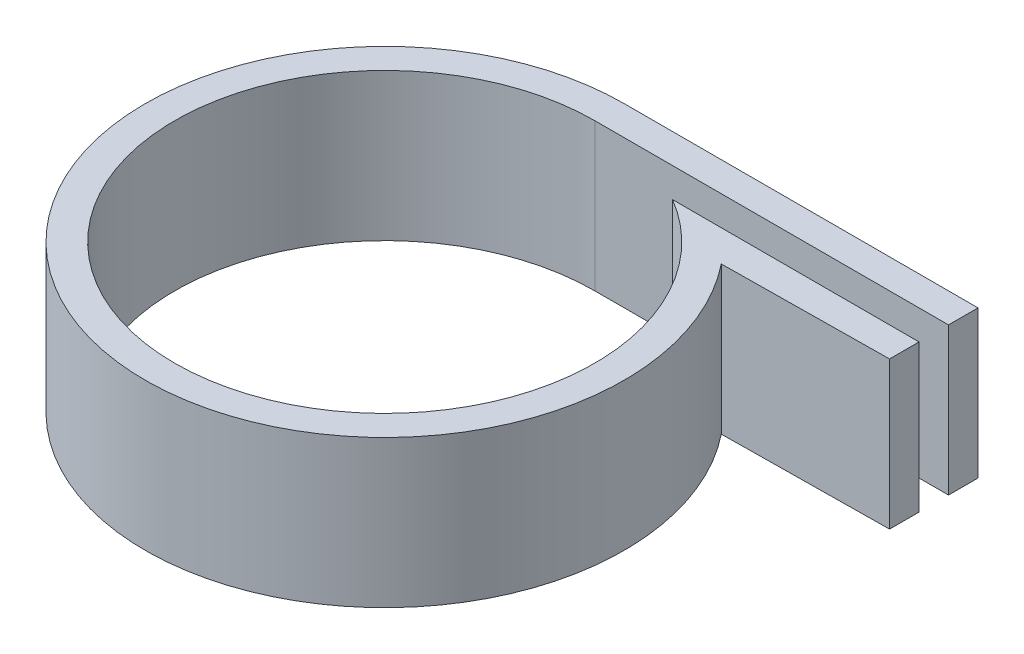
ISO-10303-21;
HEADER;
FILE_DESCRIPTION(('STEP AP214'),'2;1');
FILE_NAME('part.step','',(''),(''),'','','');
FILE_SCHEMA(('AUTOMOTIVE_DESIGN { 1 0 10303 214 1 1 1 1 }'));
ENDSEC;
DATA;
#1=APPLICATION_CONTEXT('core data for automotive mechanical design processes');
#2=APPLICATION_PROTOCOL_DEFINITION('international standard','automotive_design',2000,#1);
#3=PRODUCT_CONTEXT('',#1,'mechanical');
#4=PRODUCT('Part','Part','',(#3));
#5=PRODUCT_RELATED_PRODUCT_CATEGORY('part','',(#4));
#6=PRODUCT_DEFINITION_FORMATION('','',#4);
#7=PRODUCT_DEFINITION_CONTEXT('part definition',#1,'design');
#8=PRODUCT_DEFINITION('design','',#6,#7);
#9=PRODUCT_DEFINITION_SHAPE('','',#8);
#10=(LENGTH_UNIT() NAMED_UNIT(*) SI_UNIT(.MILLI.,.METRE.));
#11=(NAMED_UNIT(*) PLANE_ANGLE_UNIT() SI_UNIT($,.RADIAN.));
#12=(NAMED_UNIT(*) SI_UNIT($,.STERADIAN.) SOLID_ANGLE_UNIT());
#13=UNCERTAINTY_MEASURE_WITH_UNIT(LENGTH_MEASURE(1.E-05),#10,'distance_accuracy_value','');
#14=(GEOMETRIC_REPRESENTATION_CONTEXT(3) GLOBAL_UNCERTAINTY_ASSIGNED_CONTEXT((#13)) GLOBAL_UNIT_ASSIGNED_CONTEXT((#10,
#11,#12)) REPRESENTATION_CONTEXT('',''));
#15=CARTESIAN_POINT('',(0.,0.,0.));
#16=DIRECTION('',(0.,0.,1.));
#17=DIRECTION('',(1.,0.,0.));
#18=AXIS2_PLACEMENT_3D('',#15,#16,#17);
#19=CARTESIAN_POINT('',(0.,10.,0.));
#20=DIRECTION('',(0.,-1.,0.));
#21=DIRECTION('',(0.,0.,-1.));
#22=AXIS2_PLACEMENT_3D('',#19,#20,#21);
#23=CYLINDRICAL_SURFACE('',#22,16.25);
#24=CARTESIAN_POINT('',(0.,0.,0.));
#25=DIRECTION('',(0.,1.,0.));
#26=DIRECTION('',(0.,0.,1.));
#27=AXIS2_PLACEMENT_3D('',#24,#25,#26);
#28=CIRCLE('',#27,16.25);
#29=CARTESIAN_POINT('',(0.,0.,-16.25));
#30=VERTEX_POINT('',#29);
#31=CARTESIAN_POINT('',(12.7120506340973,0.,-10.1225623572367));
#32=VERTEX_POINT('',#31);
#33=EDGE_CURVE('E129',#30,#32,#28,.T.);
#34=ORIENTED_EDGE('',*,*,#33,.T.);
#35=DIRECTION('',(0.,-1.,0.));
#36=VECTOR('',#35,1.);
#37=CARTESIAN_POINT('',(12.7120506340973,10.,-10.1225623572367));
#38=LINE('',#37,#36);
#39=CARTESIAN_POINT('',(12.7120506340973,10.,-10.1225623572367));
#40=VERTEX_POINT('',#39);
#41=EDGE_CURVE('E11',#40,#32,#38,.T.);
#42=ORIENTED_EDGE('',*,*,#41,.F.);
#43=CARTESIAN_POINT('',(0.,10.,0.));
#44=DIRECTION('',(0.,1.,0.));
#45=DIRECTION('',(0.,0.,1.));
#46=AXIS2_PLACEMENT_3D('',#43,#44,#45);
#47=CIRCLE('',#46,16.25);
#48=CARTESIAN_POINT('',(0.,10.,-16.25));
#49=VERTEX_POINT('',#48);
#50=EDGE_CURVE('E143',#49,#40,#47,.T.);
#51=ORIENTED_EDGE('',*,*,#50,.F.);
#52=DIRECTION('',(0.,-1.,0.));
#53=VECTOR('',#52,1.);
#54=CARTESIAN_POINT('',(0.,10.,-16.25));
#55=LINE('',#54,#53);
#56=EDGE_CURVE('E125',#49,#30,#55,.T.);
#57=ORIENTED_EDGE('',*,*,#56,.T.);
#58=EDGE_LOOP('',(#34,#42,#51,#57));
#59=FACE_BOUND('',#58,.T.);
#60=ADVANCED_FACE('F33',(#59),#23,.T.);
#61=CARTESIAN_POINT('',(24.,10.,-10.25));
#62=DIRECTION('',(-0.0112889877486131,0.,-0.999936277347518));
#63=DIRECTION('',(-0.999936277347518,0.,0.0112889877486131));
#64=AXIS2_PLACEMENT_3D('',#61,#62,#63);
#65=PLANE('',#64);
#66=DIRECTION('',(0.999936277347518,0.,-0.0112889877486131));
#67=VECTOR('',#66,1.);
#68=CARTESIAN_POINT('',(24.,0.,-10.25));
#69=LINE('',#68,#67);
#70=CARTESIAN_POINT('',(24.,0.,-10.25));
#71=VERTEX_POINT('',#70);
#72=EDGE_CURVE('E132',#32,#71,#69,.T.);
#73=ORIENTED_EDGE('',*,*,#72,.T.);
#74=DIRECTION('',(0.,-1.,0.));
#75=VECTOR('',#74,1.);
#76=CARTESIAN_POINT('',(24.,10.,-10.25));
#77=LINE('',#76,#75);
#78=CARTESIAN_POINT('',(24.,10.,-10.25));
#79=VERTEX_POINT('',#78);
#80=EDGE_CURVE('E41',#79,#71,#77,.T.);
#81=ORIENTED_EDGE('',*,*,#80,.F.);
#82=DIRECTION('',(0.999936277347518,0.,-0.0112889877486131));
#83=VECTOR('',#82,1.);
#84=CARTESIAN_POINT('',(24.,10.,-10.25));
#85=LINE('',#84,#83);
#86=EDGE_CURVE('E92',#40,#79,#85,.T.);
#87=ORIENTED_EDGE('',*,*,#86,.F.);
#88=ORIENTED_EDGE('',*,*,#41,.T.);
#89=EDGE_LOOP('',(#73,#81,#87,#88));
#90=FACE_BOUND('',#89,.T.);
#91=ADVANCED_FACE('F178',(#90),#65,.F.);
#92=CARTESIAN_POINT('',(24.,10.,-12.25));
#93=DIRECTION('',(-1.,0.,0.));
#94=DIRECTION('',(0.,0.,1.));
#95=AXIS2_PLACEMENT_3D('',#92,#93,#94);
#96=PLANE('',#95);
#97=DIRECTION('',(0.,0.,-1.));
#98=VECTOR('',#97,1.);
#99=CARTESIAN_POINT('',(24.,0.,-12.25));
#100=LINE('',#99,#98);
#101=CARTESIAN_POINT('',(24.,0.,-12.25));
#102=VERTEX_POINT('',#101);
#103=EDGE_CURVE('E134',#71,#102,#100,.T.);
#104=ORIENTED_EDGE('',*,*,#103,.T.);
#105=DIRECTION('',(0.,-1.,0.));
#106=VECTOR('',#105,1.);
#107=CARTESIAN_POINT('',(24.,10.,-12.25));
#108=LINE('',#107,#106);
#109=CARTESIAN_POINT('',(24.,10.,-12.25));
#110=VERTEX_POINT('',#109);
#111=EDGE_CURVE('E150',#110,#102,#108,.T.);
#112=ORIENTED_EDGE('',*,*,#111,.F.);
#113=DIRECTION('',(0.,0.,-1.));
#114=VECTOR('',#113,1.);
#115=CARTESIAN_POINT('',(24.,10.,-12.25));
#116=LINE('',#115,#114);
#117=EDGE_CURVE('E158',#79,#110,#116,.T.);
#118=ORIENTED_EDGE('',*,*,#117,.F.);
#119=ORIENTED_EDGE('',*,*,#80,.T.);
#120=EDGE_LOOP('',(#104,#112,#118,#119));
#121=FACE_BOUND('',#120,.T.);
#122=ADVANCED_FACE('F156',(#121),#96,.F.);
#123=CARTESIAN_POINT('',(7.28010988928052,10.,-12.25));
#124=DIRECTION('',(0.,0.,1.));
#125=DIRECTION('',(1.,0.,0.));
#126=AXIS2_PLACEMENT_3D('',#123,#124,#125);
#127=PLANE('',#126);
#128=DIRECTION('',(-1.,0.,0.));
#129=VECTOR('',#128,1.);
#130=CARTESIAN_POINT('',(7.28010988928052,0.,-12.25));
#131=LINE('',#130,#129);
#132=CARTESIAN_POINT('',(7.28010988928052,0.,-12.25));
#133=VERTEX_POINT('',#132);
#134=EDGE_CURVE('E136',#102,#133,#131,.T.);
#135=ORIENTED_EDGE('',*,*,#134,.T.);
#136=DIRECTION('',(0.,-1.,0.));
#137=VECTOR('',#136,1.);
#138=CARTESIAN_POINT('',(7.28010988928052,10.,-12.25));
#139=LINE('',#138,#137);
#140=CARTESIAN_POINT('',(7.28010988928052,10.,-12.25));
#141=VERTEX_POINT('',#140);
#142=EDGE_CURVE('E147',#141,#133,#139,.T.);
#143=ORIENTED_EDGE('',*,*,#142,.F.);
#144=DIRECTION('',(-1.,0.,0.));
#145=VECTOR('',#144,1.);
#146=CARTESIAN_POINT('',(7.28010988928052,10.,-12.25));
#147=LINE('',#146,#145);
#148=EDGE_CURVE('E170',#110,#141,#147,.T.);
#149=ORIENTED_EDGE('',*,*,#148,.F.);
#150=ORIENTED_EDGE('',*,*,#111,.T.);
#151=EDGE_LOOP('',(#135,#143,#149,#150));
#152=FACE_BOUND('',#151,.T.);
#153=ADVANCED_FACE('F166',(#152),#127,.F.);
#154=CARTESIAN_POINT('',(0.,10.,0.));
#155=DIRECTION('',(0.,-1.,0.));
#156=DIRECTION('',(0.,0.,-1.));
#157=AXIS2_PLACEMENT_3D('',#154,#155,#156);
#158=CYLINDRICAL_SURFACE('',#157,14.25);
#159=CARTESIAN_POINT('',(0.,0.,0.));
#160=DIRECTION('',(0.,-1.,0.));
#161=DIRECTION('',(0.,0.,1.));
#162=AXIS2_PLACEMENT_3D('',#159,#160,#161);
#163=CIRCLE('',#162,14.25);
#164=CARTESIAN_POINT('',(0.,0.,-14.25));
#165=VERTEX_POINT('',#164);
#166=EDGE_CURVE('E138',#133,#165,#163,.T.);
#167=ORIENTED_EDGE('',*,*,#166,.T.);
#168=DIRECTION('',(0.,-1.,0.));
#169=VECTOR('',#168,1.);
#170=CARTESIAN_POINT('',(0.,10.,-14.25));
#171=LINE('',#170,#169);
#172=CARTESIAN_POINT('',(0.,10.,-14.25));
#173=VERTEX_POINT('',#172);
#174=EDGE_CURVE('E120',#173,#165,#171,.T.);
#175=ORIENTED_EDGE('',*,*,#174,.F.);
#176=CARTESIAN_POINT('',(0.,10.,0.));
#177=DIRECTION('',(0.,-1.,0.));
#178=DIRECTION('',(0.,0.,1.));
#179=AXIS2_PLACEMENT_3D('',#176,#177,#178);
#180=CIRCLE('',#179,14.25);
#181=EDGE_CURVE('E111',#141,#173,#180,.T.);
#182=ORIENTED_EDGE('',*,*,#181,.F.);
#183=ORIENTED_EDGE('',*,*,#142,.T.);
#184=EDGE_LOOP('',(#167,#175,#182,#183));
#185=FACE_BOUND('',#184,.T.);
#186=ADVANCED_FACE('F169',(#185),#158,.F.);
#187=CARTESIAN_POINT('',(0.,10.,-14.25));
#188=DIRECTION('',(0.,0.,-1.));
#189=DIRECTION('',(-1.,0.,0.));
#190=AXIS2_PLACEMENT_3D('',#187,#188,#189);
#191=PLANE('',#190);
#192=DIRECTION('',(1.,0.,0.));
#193=VECTOR('',#192,1.);
#194=CARTESIAN_POINT('',(0.,0.,-14.25));
#195=LINE('',#194,#193);
#196=CARTESIAN_POINT('',(24.,0.,-14.25));
#197=VERTEX_POINT('',#196);
#198=EDGE_CURVE('E119',#165,#197,#195,.T.);
#199=ORIENTED_EDGE('',*,*,#198,.T.);
#200=DIRECTION('',(0.,-1.,0.));
#201=VECTOR('',#200,1.);
#202=CARTESIAN_POINT('',(24.,10.,-14.25));
#203=LINE('',#202,#201);
#204=CARTESIAN_POINT('',(24.,10.,-14.25));
#205=VERTEX_POINT('',#204);
#206=EDGE_CURVE('E116',#205,#197,#203,.T.);
#207=ORIENTED_EDGE('',*,*,#206,.F.);
#208=DIRECTION('',(1.,0.,0.));
#209=VECTOR('',#208,1.);
#210=CARTESIAN_POINT('',(0.,10.,-14.25));
#211=LINE('',#210,#209);
#212=EDGE_CURVE('E105',#173,#205,#211,.T.);
#213=ORIENTED_EDGE('',*,*,#212,.F.);
#214=ORIENTED_EDGE('',*,*,#174,.T.);
#215=EDGE_LOOP('',(#199,#207,#213,#214));
#216=FACE_BOUND('',#215,.T.);
#217=ADVANCED_FACE('F117',(#216),#191,.F.);
#218=CARTESIAN_POINT('',(24.,10.,-16.25));
#219=DIRECTION('',(-1.,0.,0.));
#220=DIRECTION('',(0.,0.,1.));
#221=AXIS2_PLACEMENT_3D('',#218,#219,#220);
#222=PLANE('',#221);
#223=DIRECTION('',(0.,0.,-1.));
#224=VECTOR('',#223,1.);
#225=CARTESIAN_POINT('',(24.,0.,-16.25));
#226=LINE('',#225,#224);
#227=CARTESIAN_POINT('',(24.,0.,-16.25));
#228=VERTEX_POINT('',#227);
#229=EDGE_CURVE('E78',#197,#228,#226,.T.);
#230=ORIENTED_EDGE('',*,*,#229,.T.);
#231=DIRECTION('',(0.,-1.,0.));
#232=VECTOR('',#231,1.);
#233=CARTESIAN_POINT('',(24.,10.,-16.25));
#234=LINE('',#233,#232);
#235=CARTESIAN_POINT('',(24.,10.,-16.25));
#236=VERTEX_POINT('',#235);
#237=EDGE_CURVE('E121',#236,#228,#234,.T.);
#238=ORIENTED_EDGE('',*,*,#237,.F.);
#239=DIRECTION('',(0.,0.,-1.));
#240=VECTOR('',#239,1.);
#241=CARTESIAN_POINT('',(24.,10.,-16.25));
#242=LINE('',#241,#240);
#243=EDGE_CURVE('E109',#205,#236,#242,.T.);
#244=ORIENTED_EDGE('',*,*,#243,.F.);
#245=ORIENTED_EDGE('',*,*,#206,.T.);
#246=EDGE_LOOP('',(#230,#238,#244,#245));
#247=FACE_BOUND('',#246,.T.);
#248=ADVANCED_FACE('F123',(#247),#222,.F.);
#249=CARTESIAN_POINT('',(0.,10.,-16.25));
#250=DIRECTION('',(0.,0.,1.));
#251=DIRECTION('',(1.,0.,0.));
#252=AXIS2_PLACEMENT_3D('',#249,#250,#251);
#253=PLANE('',#252);
#254=DIRECTION('',(-1.,0.,0.));
#255=VECTOR('',#254,1.);
#256=CARTESIAN_POINT('',(0.,0.,-16.25));
#257=LINE('',#256,#255);
#258=EDGE_CURVE('E84',#228,#30,#257,.T.);
#259=ORIENTED_EDGE('',*,*,#258,.T.);
#260=ORIENTED_EDGE('',*,*,#56,.F.);
#261=DIRECTION('',(-1.,0.,0.));
#262=VECTOR('',#261,1.);
#263=CARTESIAN_POINT('',(0.,10.,-16.25));
#264=LINE('',#263,#262);
#265=EDGE_CURVE('E49',#236,#49,#264,.T.);
#266=ORIENTED_EDGE('',*,*,#265,.F.);
#267=ORIENTED_EDGE('',*,*,#237,.T.);
#268=EDGE_LOOP('',(#259,#260,#266,#267));
#269=FACE_BOUND('',#268,.T.);
#270=ADVANCED_FACE('F194',(#269),#253,.F.);
#271=CARTESIAN_POINT('',(0.,10.,0.));
#272=DIRECTION('',(0.,1.,0.));
#273=DIRECTION('',(0.,0.,1.));
#274=AXIS2_PLACEMENT_3D('',#271,#272,#273);
#275=PLANE('',#274);
#276=ORIENTED_EDGE('',*,*,#50,.T.);
#277=ORIENTED_EDGE('',*,*,#86,.T.);
#278=ORIENTED_EDGE('',*,*,#117,.T.);
#279=ORIENTED_EDGE('',*,*,#148,.T.);
#280=ORIENTED_EDGE('',*,*,#181,.T.);
#281=ORIENTED_EDGE('',*,*,#212,.T.);
#282=ORIENTED_EDGE('',*,*,#243,.T.);
#283=ORIENTED_EDGE('',*,*,#265,.T.);
#284=EDGE_LOOP('',(#276,#277,#278,#279,#280,#281,#282,#283));
#285=FACE_BOUND('',#284,.T.);
#286=ADVANCED_FACE('F107',(#285),#275,.T.);
#287=CARTESIAN_POINT('',(0.,0.,0.));
#288=DIRECTION('',(0.,1.,0.));
#289=DIRECTION('',(0.,0.,1.));
#290=AXIS2_PLACEMENT_3D('',#287,#288,#289);
#291=PLANE('',#290);
#292=ORIENTED_EDGE('',*,*,#33,.F.);
#293=ORIENTED_EDGE('',*,*,#258,.F.);
#294=ORIENTED_EDGE('',*,*,#229,.F.);
#295=ORIENTED_EDGE('',*,*,#198,.F.);
#296=ORIENTED_EDGE('',*,*,#166,.F.);
#297=ORIENTED_EDGE('',*,*,#134,.F.);
#298=ORIENTED_EDGE('',*,*,#103,.F.);
#299=ORIENTED_EDGE('',*,*,#72,.F.);
#300=EDGE_LOOP('',(#292,#293,#294,#295,#296,#297,#298,#299));
#301=FACE_BOUND('',#300,.T.);
#302=ADVANCED_FACE('F162',(#301),#291,.F.);
#303=CLOSED_SHELL('',(#60,#91,#122,#153,#186,#217,#248,#270,#286,#302));
#304=MANIFOLD_SOLID_BREP('B2',#303);
#305=ADVANCED_BREP_SHAPE_REPRESENTATION('',(#18,#304),#14);
#306=SHAPE_DEFINITION_REPRESENTATION(#9,#305);
ENDSEC;
END-ISO-10303-21;
